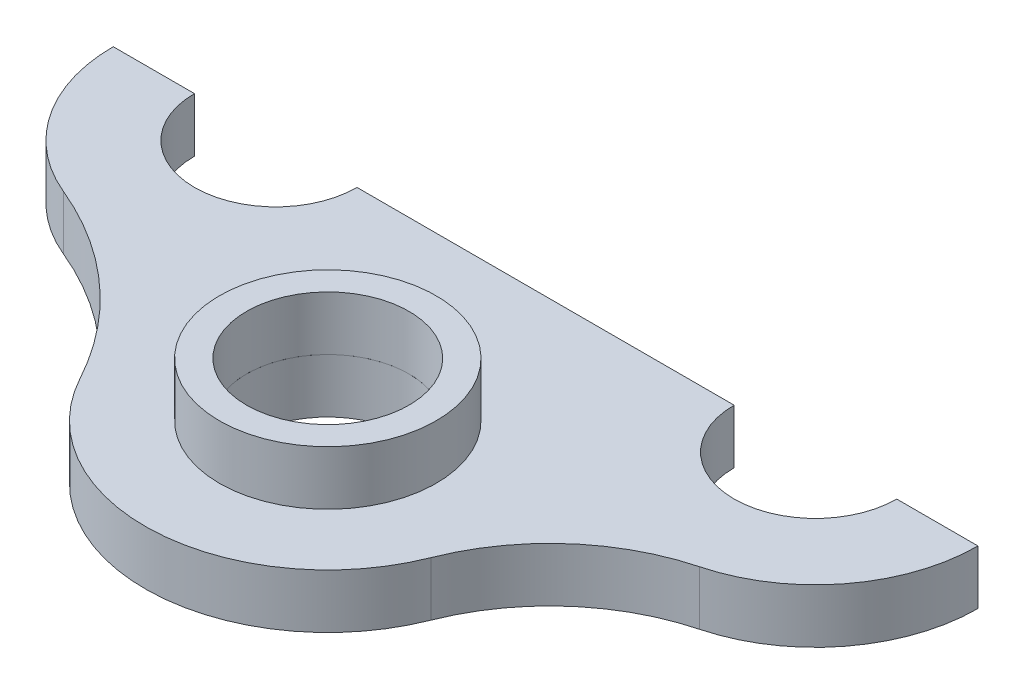
ISO-10303-21;
HEADER;
FILE_DESCRIPTION(('STEP AP214'),'2;1');
FILE_NAME('part.step','',(''),(''),'','','');
FILE_SCHEMA(('AUTOMOTIVE_DESIGN { 1 0 10303 214 1 1 1 1 }'));
ENDSEC;
DATA;
#1=APPLICATION_CONTEXT('core data for automotive mechanical design processes');
#2=APPLICATION_PROTOCOL_DEFINITION('international standard','automotive_design',2000,#1);
#3=PRODUCT_CONTEXT('',#1,'mechanical');
#4=PRODUCT('Part','Part','',(#3));
#5=PRODUCT_RELATED_PRODUCT_CATEGORY('part','',(#4));
#6=PRODUCT_DEFINITION_FORMATION('','',#4);
#7=PRODUCT_DEFINITION_CONTEXT('part definition',#1,'design');
#8=PRODUCT_DEFINITION('design','',#6,#7);
#9=PRODUCT_DEFINITION_SHAPE('','',#8);
#10=(LENGTH_UNIT() NAMED_UNIT(*) SI_UNIT(.MILLI.,.METRE.));
#11=(NAMED_UNIT(*) PLANE_ANGLE_UNIT() SI_UNIT($,.RADIAN.));
#12=(NAMED_UNIT(*) SI_UNIT($,.STERADIAN.) SOLID_ANGLE_UNIT());
#13=UNCERTAINTY_MEASURE_WITH_UNIT(LENGTH_MEASURE(1.E-05),#10,'distance_accuracy_value','');
#14=(GEOMETRIC_REPRESENTATION_CONTEXT(3) GLOBAL_UNCERTAINTY_ASSIGNED_CONTEXT((#13)) GLOBAL_UNIT_ASSIGNED_CONTEXT((#10,
#11,#12)) REPRESENTATION_CONTEXT('',''));
#15=CARTESIAN_POINT('',(0.,0.,0.));
#16=DIRECTION('',(0.,0.,1.));
#17=DIRECTION('',(1.,0.,0.));
#18=AXIS2_PLACEMENT_3D('',#15,#16,#17);
#19=CARTESIAN_POINT('',(-12.0416183066735,15.875,13.7069856357759));
#20=DIRECTION('',(0.,1.,0.));
#21=DIRECTION('',(0.,0.,1.));
#22=AXIS2_PLACEMENT_3D('',#19,#20,#21);
#23=CYLINDRICAL_SURFACE('',#22,10.0791971458195);
#24=CARTESIAN_POINT('',(-12.0416183066735,17.4625,13.7069856357759));
#25=DIRECTION('',(0.,-1.,0.));
#26=DIRECTION('',(0.,0.,-1.));
#27=AXIS2_PLACEMENT_3D('',#24,#25,#26);
#28=CIRCLE('',#27,10.0791971458195);
#29=CARTESIAN_POINT('',(-8.17636338143898,17.4625,4.39838641423633));
#30=VERTEX_POINT('',#29);
#31=CARTESIAN_POINT('',(-3.18150834841455,17.4625,8.90191886913695));
#32=VERTEX_POINT('',#31);
#33=EDGE_CURVE('E166',#30,#32,#28,.T.);
#34=ORIENTED_EDGE('',*,*,#33,.F.);
#35=DIRECTION('',(0.,1.,0.));
#36=VECTOR('',#35,1.);
#37=CARTESIAN_POINT('',(-8.17636338143898,15.875,4.39838641423633));
#38=LINE('',#37,#36);
#39=CARTESIAN_POINT('',(-8.17636338143898,15.875,4.39838641423633));
#40=VERTEX_POINT('',#39);
#41=EDGE_CURVE('E12',#40,#30,#38,.T.);
#42=ORIENTED_EDGE('',*,*,#41,.F.);
#43=CARTESIAN_POINT('',(-12.0416183066735,15.875,13.7069856357759));
#44=DIRECTION('',(0.,-1.,0.));
#45=DIRECTION('',(0.,0.,-1.));
#46=AXIS2_PLACEMENT_3D('',#43,#44,#45);
#47=CIRCLE('',#46,10.0791971458195);
#48=CARTESIAN_POINT('',(-3.18150834841455,15.875,8.90191886913695));
#49=VERTEX_POINT('',#48);
#50=EDGE_CURVE('E145',#40,#49,#47,.T.);
#51=ORIENTED_EDGE('',*,*,#50,.T.);
#52=DIRECTION('',(0.,1.,0.));
#53=VECTOR('',#52,1.);
#54=CARTESIAN_POINT('',(-3.18150834841455,15.875,8.90191886913695));
#55=LINE('',#54,#53);
#56=EDGE_CURVE('E165',#49,#32,#55,.T.);
#57=ORIENTED_EDGE('',*,*,#56,.T.);
#58=EDGE_LOOP('',(#34,#42,#51,#57));
#59=FACE_BOUND('',#58,.T.);
#60=ADVANCED_FACE('F43',(#59),#23,.F.);
#61=CARTESIAN_POINT('',(-6.35,15.875,0.));
#62=DIRECTION('',(0.,1.,0.));
#63=DIRECTION('',(0.,0.,1.));
#64=AXIS2_PLACEMENT_3D('',#61,#62,#63);
#65=CYLINDRICAL_SURFACE('',#64,4.7625);
#66=CARTESIAN_POINT('',(-6.35,17.4625,0.));
#67=DIRECTION('',(0.,-1.,0.));
#68=DIRECTION('',(0.,0.,-1.));
#69=AXIS2_PLACEMENT_3D('',#66,#67,#68);
#70=CIRCLE('',#69,4.7625);
#71=CARTESIAN_POINT('',(-11.1125,17.4625,0.));
#72=VERTEX_POINT('',#71);
#73=EDGE_CURVE('E139',#30,#72,#70,.T.);
#74=ORIENTED_EDGE('',*,*,#73,.T.);
#75=DIRECTION('',(0.,1.,0.));
#76=VECTOR('',#75,1.);
#77=CARTESIAN_POINT('',(-11.1125,15.875,0.));
#78=LINE('',#77,#76);
#79=CARTESIAN_POINT('',(-11.1125,15.875,0.));
#80=VERTEX_POINT('',#79);
#81=EDGE_CURVE('E120',#80,#72,#78,.T.);
#82=ORIENTED_EDGE('',*,*,#81,.F.);
#83=CARTESIAN_POINT('',(-6.35,15.875,0.));
#84=DIRECTION('',(0.,-1.,0.));
#85=DIRECTION('',(0.,0.,-1.));
#86=AXIS2_PLACEMENT_3D('',#83,#84,#85);
#87=CIRCLE('',#86,4.7625);
#88=EDGE_CURVE('E136',#40,#80,#87,.T.);
#89=ORIENTED_EDGE('',*,*,#88,.F.);
#90=ORIENTED_EDGE('',*,*,#41,.T.);
#91=EDGE_LOOP('',(#74,#82,#89,#90));
#92=FACE_BOUND('',#91,.T.);
#93=ADVANCED_FACE('F135',(#92),#65,.T.);
#94=CARTESIAN_POINT('',(9.4615,15.875,0.));
#95=DIRECTION('',(0.,1.,0.));
#96=DIRECTION('',(0.,0.,1.));
#97=AXIS2_PLACEMENT_3D('',#94,#95,#96);
#98=CYLINDRICAL_SURFACE('',#97,4.7625);
#99=CARTESIAN_POINT('',(9.4615,15.875,0.));
#100=DIRECTION('',(0.,-1.,0.));
#101=DIRECTION('',(0.,0.,-1.));
#102=AXIS2_PLACEMENT_3D('',#99,#100,#101);
#103=CIRCLE('',#102,4.7625);
#104=CARTESIAN_POINT('',(14.224,15.875,0.));
#105=VERTEX_POINT('',#104);
#106=CARTESIAN_POINT('',(10.6744794197619,15.875,4.60544104046877));
#107=VERTEX_POINT('',#106);
#108=EDGE_CURVE('E146',#105,#107,#103,.T.);
#109=ORIENTED_EDGE('',*,*,#108,.F.);
#110=DIRECTION('',(0.,1.,0.));
#111=VECTOR('',#110,1.);
#112=CARTESIAN_POINT('',(14.224,15.875,0.));
#113=LINE('',#112,#111);
#114=CARTESIAN_POINT('',(14.224,17.4625,0.));
#115=VERTEX_POINT('',#114);
#116=EDGE_CURVE('E169',#105,#115,#113,.T.);
#117=ORIENTED_EDGE('',*,*,#116,.T.);
#118=CARTESIAN_POINT('',(9.4615,17.4625,0.));
#119=DIRECTION('',(0.,-1.,0.));
#120=DIRECTION('',(0.,0.,-1.));
#121=AXIS2_PLACEMENT_3D('',#118,#119,#120);
#122=CIRCLE('',#121,4.7625);
#123=CARTESIAN_POINT('',(10.6744794197619,17.4625,4.60544104046877));
#124=VERTEX_POINT('',#123);
#125=EDGE_CURVE('E171',#115,#124,#122,.T.);
#126=ORIENTED_EDGE('',*,*,#125,.T.);
#127=DIRECTION('',(0.,1.,0.));
#128=VECTOR('',#127,1.);
#129=CARTESIAN_POINT('',(10.6744794197619,15.875,4.60544104046877));
#130=LINE('',#129,#128);
#131=EDGE_CURVE('E50',#107,#124,#130,.T.);
#132=ORIENTED_EDGE('',*,*,#131,.F.);
#133=EDGE_LOOP('',(#109,#117,#126,#132));
#134=FACE_BOUND('',#133,.T.);
#135=ADVANCED_FACE('F208',(#134),#98,.T.);
#136=CARTESIAN_POINT('',(12.2461179670708,15.875,10.5726392868988));
#137=DIRECTION('',(0.,1.,0.));
#138=DIRECTION('',(0.,0.,1.));
#139=AXIS2_PLACEMENT_3D('',#136,#137,#138);
#140=CYLINDRICAL_SURFACE('',#139,6.17069709478477);
#141=CARTESIAN_POINT('',(12.2461179670708,17.4625,10.5726392868988));
#142=DIRECTION('',(0.,-1.,0.));
#143=DIRECTION('',(0.,0.,-1.));
#144=AXIS2_PLACEMENT_3D('',#141,#142,#143);
#145=CIRCLE('',#144,6.17069709478477);
#146=CARTESIAN_POINT('',(6.50462586633258,17.4625,8.31149552925187));
#147=VERTEX_POINT('',#146);
#148=EDGE_CURVE('E173',#147,#124,#145,.T.);
#149=ORIENTED_EDGE('',*,*,#148,.F.);
#150=DIRECTION('',(0.,1.,0.));
#151=VECTOR('',#150,1.);
#152=CARTESIAN_POINT('',(6.50462586633258,15.875,8.31149552925187));
#153=LINE('',#152,#151);
#154=CARTESIAN_POINT('',(6.50462586633258,15.875,8.31149552925187));
#155=VERTEX_POINT('',#154);
#156=EDGE_CURVE('E188',#155,#147,#153,.T.);
#157=ORIENTED_EDGE('',*,*,#156,.F.);
#158=CARTESIAN_POINT('',(12.2461179670708,15.875,10.5726392868988));
#159=DIRECTION('',(0.,-1.,0.));
#160=DIRECTION('',(0.,0.,-1.));
#161=AXIS2_PLACEMENT_3D('',#158,#159,#160);
#162=CIRCLE('',#161,6.17069709478477);
#163=EDGE_CURVE('E148',#155,#107,#162,.T.);
#164=ORIENTED_EDGE('',*,*,#163,.T.);
#165=ORIENTED_EDGE('',*,*,#131,.T.);
#166=EDGE_LOOP('',(#149,#157,#164,#165));
#167=FACE_BOUND('',#166,.T.);
#168=ADVANCED_FACE('F193',(#167),#140,.F.);
#169=CARTESIAN_POINT('',(9.4615,15.875,0.));
#170=DIRECTION('',(0.,1.,0.));
#171=DIRECTION('',(0.,0.,1.));
#172=AXIS2_PLACEMENT_3D('',#169,#170,#171);
#173=CYLINDRICAL_SURFACE('',#172,2.38125);
#174=DIRECTION('',(0.,1.,0.));
#175=VECTOR('',#174,1.);
#176=CARTESIAN_POINT('',(11.84275,15.875,0.));
#177=LINE('',#176,#175);
#178=CARTESIAN_POINT('',(11.84275,15.875,0.));
#179=VERTEX_POINT('',#178);
#180=CARTESIAN_POINT('',(11.84275,17.4625,0.));
#181=VERTEX_POINT('',#180);
#182=EDGE_CURVE('E65',#179,#181,#177,.T.);
#183=ORIENTED_EDGE('',*,*,#182,.F.);
#184=CARTESIAN_POINT('',(9.4615,15.875,0.));
#185=DIRECTION('',(0.,-1.,0.));
#186=DIRECTION('',(0.,0.,-1.));
#187=AXIS2_PLACEMENT_3D('',#184,#185,#186);
#188=CIRCLE('',#187,2.38125);
#189=CARTESIAN_POINT('',(7.08025,15.875,0.));
#190=VERTEX_POINT('',#189);
#191=EDGE_CURVE('E160',#179,#190,#188,.T.);
#192=ORIENTED_EDGE('',*,*,#191,.T.);
#193=DIRECTION('',(0.,1.,0.));
#194=VECTOR('',#193,1.);
#195=CARTESIAN_POINT('',(7.08025,15.875,0.));
#196=LINE('',#195,#194);
#197=CARTESIAN_POINT('',(7.08025,17.4625,0.));
#198=VERTEX_POINT('',#197);
#199=EDGE_CURVE('E210',#190,#198,#196,.T.);
#200=ORIENTED_EDGE('',*,*,#199,.T.);
#201=CARTESIAN_POINT('',(9.4615,17.4625,0.));
#202=DIRECTION('',(0.,-1.,0.));
#203=DIRECTION('',(0.,0.,-1.));
#204=AXIS2_PLACEMENT_3D('',#201,#202,#203);
#205=CIRCLE('',#204,2.38125);
#206=EDGE_CURVE('E182',#181,#198,#205,.T.);
#207=ORIENTED_EDGE('',*,*,#206,.F.);
#208=EDGE_LOOP('',(#183,#192,#200,#207));
#209=FACE_BOUND('',#208,.T.);
#210=ADVANCED_FACE('F225',(#209),#173,.F.);
#211=CARTESIAN_POINT('',(1.524,15.875,6.35));
#212=DIRECTION('',(0.,1.,0.));
#213=DIRECTION('',(0.,0.,1.));
#214=AXIS2_PLACEMENT_3D('',#211,#212,#213);
#215=CYLINDRICAL_SURFACE('',#214,2.38125);
#216=CARTESIAN_POINT('',(1.524,15.875,6.35));
#217=DIRECTION('',(0.,-1.,0.));
#218=DIRECTION('',(0.,0.,-1.));
#219=AXIS2_PLACEMENT_3D('',#216,#217,#218);
#220=CIRCLE('',#219,2.38125);
#221=CARTESIAN_POINT('',(1.524,15.875,3.96875));
#222=VERTEX_POINT('',#221);
#223=EDGE_CURVE('E157',#222,#222,#220,.F.);
#224=ORIENTED_EDGE('',*,*,#223,.F.);
#225=EDGE_LOOP('',(#224));
#226=FACE_BOUND('',#225,.T.);
#227=CARTESIAN_POINT('',(1.524,17.4625,6.35));
#228=DIRECTION('',(0.,-1.,0.));
#229=DIRECTION('',(0.,0.,-1.));
#230=AXIS2_PLACEMENT_3D('',#227,#228,#229);
#231=CIRCLE('',#230,2.38125);
#232=CARTESIAN_POINT('',(1.524,17.4625,3.96875));
#233=VERTEX_POINT('',#232);
#234=EDGE_CURVE('E179',#233,#233,#231,.F.);
#235=ORIENTED_EDGE('',*,*,#234,.T.);
#236=EDGE_LOOP('',(#235));
#237=FACE_BOUND('',#236,.T.);
#238=ADVANCED_FACE('F250',(#226,#237),#215,.F.);
#239=CARTESIAN_POINT('',(1.524,15.875,6.35));
#240=DIRECTION('',(0.,1.,0.));
#241=DIRECTION('',(0.,0.,1.));
#242=AXIS2_PLACEMENT_3D('',#239,#240,#241);
#243=CYLINDRICAL_SURFACE('',#242,5.35295233788386);
#244=CARTESIAN_POINT('',(1.524,17.4625,6.35));
#245=DIRECTION('',(0.,-1.,0.));
#246=DIRECTION('',(0.,0.,-1.));
#247=AXIS2_PLACEMENT_3D('',#244,#245,#246);
#248=CIRCLE('',#247,5.35295233788386);
#249=EDGE_CURVE('E176',#147,#32,#248,.T.);
#250=ORIENTED_EDGE('',*,*,#249,.T.);
#251=ORIENTED_EDGE('',*,*,#56,.F.);
#252=CARTESIAN_POINT('',(1.524,15.875,6.35));
#253=DIRECTION('',(0.,-1.,0.));
#254=DIRECTION('',(0.,0.,-1.));
#255=AXIS2_PLACEMENT_3D('',#252,#253,#254);
#256=CIRCLE('',#255,5.35295233788386);
#257=EDGE_CURVE('E155',#155,#49,#256,.T.);
#258=ORIENTED_EDGE('',*,*,#257,.F.);
#259=ORIENTED_EDGE('',*,*,#156,.T.);
#260=EDGE_LOOP('',(#250,#251,#258,#259));
#261=FACE_BOUND('',#260,.T.);
#262=ADVANCED_FACE('F204',(#261),#243,.T.);
#263=CARTESIAN_POINT('',(-6.35,15.875,0.));
#264=DIRECTION('',(0.,1.,0.));
#265=DIRECTION('',(0.,0.,1.));
#266=AXIS2_PLACEMENT_3D('',#263,#264,#265);
#267=CYLINDRICAL_SURFACE('',#266,2.38125);
#268=DIRECTION('',(0.,1.,0.));
#269=VECTOR('',#268,1.);
#270=CARTESIAN_POINT('',(-3.96875,15.875,0.));
#271=LINE('',#270,#269);
#272=CARTESIAN_POINT('',(-3.96875,15.875,0.));
#273=VERTEX_POINT('',#272);
#274=CARTESIAN_POINT('',(-3.96875,17.4625,0.));
#275=VERTEX_POINT('',#274);
#276=EDGE_CURVE('E57',#273,#275,#271,.T.);
#277=ORIENTED_EDGE('',*,*,#276,.F.);
#278=CARTESIAN_POINT('',(-6.35,15.875,0.));
#279=DIRECTION('',(0.,-1.,0.));
#280=DIRECTION('',(0.,0.,-1.));
#281=AXIS2_PLACEMENT_3D('',#278,#279,#280);
#282=CIRCLE('',#281,2.38125);
#283=CARTESIAN_POINT('',(-8.73125,15.875,0.));
#284=VERTEX_POINT('',#283);
#285=EDGE_CURVE('E163',#273,#284,#282,.T.);
#286=ORIENTED_EDGE('',*,*,#285,.T.);
#287=DIRECTION('',(0.,1.,0.));
#288=VECTOR('',#287,1.);
#289=CARTESIAN_POINT('',(-8.73125,15.875,0.));
#290=LINE('',#289,#288);
#291=CARTESIAN_POINT('',(-8.73125,17.4625,0.));
#292=VERTEX_POINT('',#291);
#293=EDGE_CURVE('E123',#284,#292,#290,.T.);
#294=ORIENTED_EDGE('',*,*,#293,.T.);
#295=CARTESIAN_POINT('',(-6.35,17.4625,0.));
#296=DIRECTION('',(0.,-1.,0.));
#297=DIRECTION('',(0.,0.,-1.));
#298=AXIS2_PLACEMENT_3D('',#295,#296,#297);
#299=CIRCLE('',#298,2.38125);
#300=EDGE_CURVE('E150',#275,#292,#299,.T.);
#301=ORIENTED_EDGE('',*,*,#300,.F.);
#302=EDGE_LOOP('',(#277,#286,#294,#301));
#303=FACE_BOUND('',#302,.T.);
#304=ADVANCED_FACE('F220',(#303),#267,.F.);
#305=CARTESIAN_POINT('',(0.,15.875,0.));
#306=DIRECTION('',(0.,-1.,0.));
#307=DIRECTION('',(0.,0.,-1.));
#308=AXIS2_PLACEMENT_3D('',#305,#306,#307);
#309=PLANE('',#308);
#310=DIRECTION('',(1.,0.,0.));
#311=VECTOR('',#310,1.);
#312=CARTESIAN_POINT('',(0.,15.875,0.));
#313=LINE('',#312,#311);
#314=EDGE_CURVE('E131',#179,#105,#313,.T.);
#315=ORIENTED_EDGE('',*,*,#314,.T.);
#316=ORIENTED_EDGE('',*,*,#108,.T.);
#317=ORIENTED_EDGE('',*,*,#163,.F.);
#318=ORIENTED_EDGE('',*,*,#257,.T.);
#319=ORIENTED_EDGE('',*,*,#50,.F.);
#320=ORIENTED_EDGE('',*,*,#88,.T.);
#321=EDGE_CURVE('E117',#80,#284,#313,.T.);
#322=ORIENTED_EDGE('',*,*,#321,.T.);
#323=ORIENTED_EDGE('',*,*,#285,.F.);
#324=EDGE_CURVE('E128',#273,#190,#313,.T.);
#325=ORIENTED_EDGE('',*,*,#324,.T.);
#326=ORIENTED_EDGE('',*,*,#191,.F.);
#327=EDGE_LOOP('',(#315,#316,#317,#318,#319,#320,#322,#323,#325,#326));
#328=FACE_BOUND('',#327,.T.);
#329=ORIENTED_EDGE('',*,*,#223,.T.);
#330=EDGE_LOOP('',(#329));
#331=FACE_BOUND('',#330,.T.);
#332=ADVANCED_FACE('F142',(#328,#331),#309,.T.);
#333=CARTESIAN_POINT('',(0.,17.4625,0.));
#334=DIRECTION('',(0.,-1.,0.));
#335=DIRECTION('',(0.,0.,-1.));
#336=AXIS2_PLACEMENT_3D('',#333,#334,#335);
#337=PLANE('',#336);
#338=ORIENTED_EDGE('',*,*,#234,.F.);
#339=EDGE_LOOP('',(#338));
#340=FACE_BOUND('',#339,.T.);
#341=ORIENTED_EDGE('',*,*,#125,.F.);
#342=DIRECTION('',(1.,0.,0.));
#343=VECTOR('',#342,1.);
#344=CARTESIAN_POINT('',(0.,17.4625,0.));
#345=LINE('',#344,#343);
#346=EDGE_CURVE('E129',#181,#115,#345,.T.);
#347=ORIENTED_EDGE('',*,*,#346,.F.);
#348=ORIENTED_EDGE('',*,*,#206,.T.);
#349=EDGE_CURVE('E221',#275,#198,#345,.T.);
#350=ORIENTED_EDGE('',*,*,#349,.F.);
#351=ORIENTED_EDGE('',*,*,#300,.T.);
#352=EDGE_CURVE('E213',#72,#292,#345,.T.);
#353=ORIENTED_EDGE('',*,*,#352,.F.);
#354=ORIENTED_EDGE('',*,*,#73,.F.);
#355=ORIENTED_EDGE('',*,*,#33,.T.);
#356=ORIENTED_EDGE('',*,*,#249,.F.);
#357=ORIENTED_EDGE('',*,*,#148,.T.);
#358=EDGE_LOOP('',(#341,#347,#348,#350,#351,#353,#354,#355,#356,#357));
#359=FACE_BOUND('',#358,.T.);
#360=ADVANCED_FACE('F200',(#340,#359),#337,.F.);
#361=CARTESIAN_POINT('',(0.,15.875,0.));
#362=DIRECTION('',(0.,0.,1.));
#363=DIRECTION('',(1.,0.,0.));
#364=AXIS2_PLACEMENT_3D('',#361,#362,#363);
#365=PLANE('',#364);
#366=ORIENTED_EDGE('',*,*,#352,.T.);
#367=ORIENTED_EDGE('',*,*,#293,.F.);
#368=ORIENTED_EDGE('',*,*,#321,.F.);
#369=ORIENTED_EDGE('',*,*,#81,.T.);
#370=EDGE_LOOP('',(#366,#367,#368,#369));
#371=FACE_BOUND('',#370,.T.);
#372=ADVANCED_FACE('F119',(#371),#365,.F.);
#373=ORIENTED_EDGE('',*,*,#349,.T.);
#374=ORIENTED_EDGE('',*,*,#199,.F.);
#375=ORIENTED_EDGE('',*,*,#324,.F.);
#376=ORIENTED_EDGE('',*,*,#276,.T.);
#377=EDGE_LOOP('',(#373,#374,#375,#376));
#378=FACE_BOUND('',#377,.T.);
#379=ADVANCED_FACE('F227',(#378),#365,.F.);
#380=ORIENTED_EDGE('',*,*,#346,.T.);
#381=ORIENTED_EDGE('',*,*,#116,.F.);
#382=ORIENTED_EDGE('',*,*,#314,.F.);
#383=ORIENTED_EDGE('',*,*,#182,.T.);
#384=EDGE_LOOP('',(#380,#381,#382,#383));
#385=FACE_BOUND('',#384,.T.);
#386=ADVANCED_FACE('F223',(#385),#365,.F.);
#387=CLOSED_SHELL('',(#60,#93,#135,#168,#210,#238,#262,#304,#332,#360,#372,#379,#386));
#388=MANIFOLD_SOLID_BREP('B2',#387);
#389=CARTESIAN_POINT('',(1.524,17.4625,6.35));
#390=DIRECTION('',(0.,1.,0.));
#391=DIRECTION('',(0.,0.,1.));
#392=AXIS2_PLACEMENT_3D('',#389,#390,#391);
#393=PLANE('',#392);
#394=CARTESIAN_POINT('',(1.524,17.4625,6.35));
#395=DIRECTION('',(0.,1.,0.));
#396=DIRECTION('',(0.,0.,1.));
#397=AXIS2_PLACEMENT_3D('',#394,#395,#396);
#398=CIRCLE('',#397,2.38125);
#399=CARTESIAN_POINT('',(1.524,17.4625,8.73125));
#400=VERTEX_POINT('',#399);
#401=EDGE_CURVE('E384',#400,#400,#398,.T.);
#402=ORIENTED_EDGE('',*,*,#401,.T.);
#403=EDGE_LOOP('',(#402));
#404=FACE_BOUND('',#403,.T.);
#405=CARTESIAN_POINT('',(1.524,17.4625,6.35));
#406=DIRECTION('',(0.,1.,0.));
#407=DIRECTION('',(0.,0.,1.));
#408=AXIS2_PLACEMENT_3D('',#405,#406,#407);
#409=CIRCLE('',#408,3.175);
#410=CARTESIAN_POINT('',(1.524,17.4625,9.525));
#411=VERTEX_POINT('',#410);
#412=EDGE_CURVE('E42',#411,#411,#409,.T.);
#413=ORIENTED_EDGE('',*,*,#412,.F.);
#414=EDGE_LOOP('',(#413));
#415=FACE_BOUND('',#414,.T.);
#416=ADVANCED_FACE('F373',(#404,#415),#393,.F.);
#417=CARTESIAN_POINT('',(1.524,17.4625,6.35));
#418=DIRECTION('',(0.,1.,0.));
#419=DIRECTION('',(0.,0.,1.));
#420=AXIS2_PLACEMENT_3D('',#417,#418,#419);
#421=CYLINDRICAL_SURFACE('',#420,3.175);
#422=ORIENTED_EDGE('',*,*,#412,.T.);
#423=EDGE_LOOP('',(#422));
#424=FACE_BOUND('',#423,.T.);
#425=CARTESIAN_POINT('',(1.524,19.05,6.35));
#426=DIRECTION('',(0.,1.,0.));
#427=DIRECTION('',(0.,0.,1.));
#428=AXIS2_PLACEMENT_3D('',#425,#426,#427);
#429=CIRCLE('',#428,3.175);
#430=CARTESIAN_POINT('',(1.524,19.05,9.525));
#431=VERTEX_POINT('',#430);
#432=EDGE_CURVE('E377',#431,#431,#429,.T.);
#433=ORIENTED_EDGE('',*,*,#432,.F.);
#434=EDGE_LOOP('',(#433));
#435=FACE_BOUND('',#434,.T.);
#436=ADVANCED_FACE('F397',(#424,#435),#421,.T.);
#437=CARTESIAN_POINT('',(1.524,19.05,6.35));
#438=DIRECTION('',(0.,1.,0.));
#439=DIRECTION('',(0.,0.,1.));
#440=AXIS2_PLACEMENT_3D('',#437,#438,#439);
#441=PLANE('',#440);
#442=CARTESIAN_POINT('',(1.524,19.05,6.35));
#443=DIRECTION('',(0.,1.,0.));
#444=DIRECTION('',(0.,0.,1.));
#445=AXIS2_PLACEMENT_3D('',#442,#443,#444);
#446=CIRCLE('',#445,2.38125);
#447=CARTESIAN_POINT('',(1.524,19.05,8.73125));
#448=VERTEX_POINT('',#447);
#449=EDGE_CURVE('E388',#448,#448,#446,.T.);
#450=ORIENTED_EDGE('',*,*,#449,.F.);
#451=EDGE_LOOP('',(#450));
#452=FACE_BOUND('',#451,.T.);
#453=ORIENTED_EDGE('',*,*,#432,.T.);
#454=EDGE_LOOP('',(#453));
#455=FACE_BOUND('',#454,.T.);
#456=ADVANCED_FACE('F375',(#452,#455),#441,.T.);
#457=CARTESIAN_POINT('',(1.524,-1.5875,6.35));
#458=DIRECTION('',(0.,1.,0.));
#459=DIRECTION('',(0.,0.,1.));
#460=AXIS2_PLACEMENT_3D('',#457,#458,#459);
#461=CYLINDRICAL_SURFACE('',#460,2.38125);
#462=ORIENTED_EDGE('',*,*,#449,.T.);
#463=EDGE_LOOP('',(#462));
#464=FACE_BOUND('',#463,.T.);
#465=ORIENTED_EDGE('',*,*,#401,.F.);
#466=EDGE_LOOP('',(#465));
#467=FACE_BOUND('',#466,.T.);
#468=ADVANCED_FACE('F392',(#464,#467),#461,.F.);
#469=CLOSED_SHELL('',(#416,#436,#456,#468));
#470=MANIFOLD_SOLID_BREP('B6',#469);
#471=ADVANCED_BREP_SHAPE_REPRESENTATION('',(#18,#388,#470),#14);
#472=SHAPE_DEFINITION_REPRESENTATION(#9,#471);
ENDSEC;
END-ISO-10303-21;
